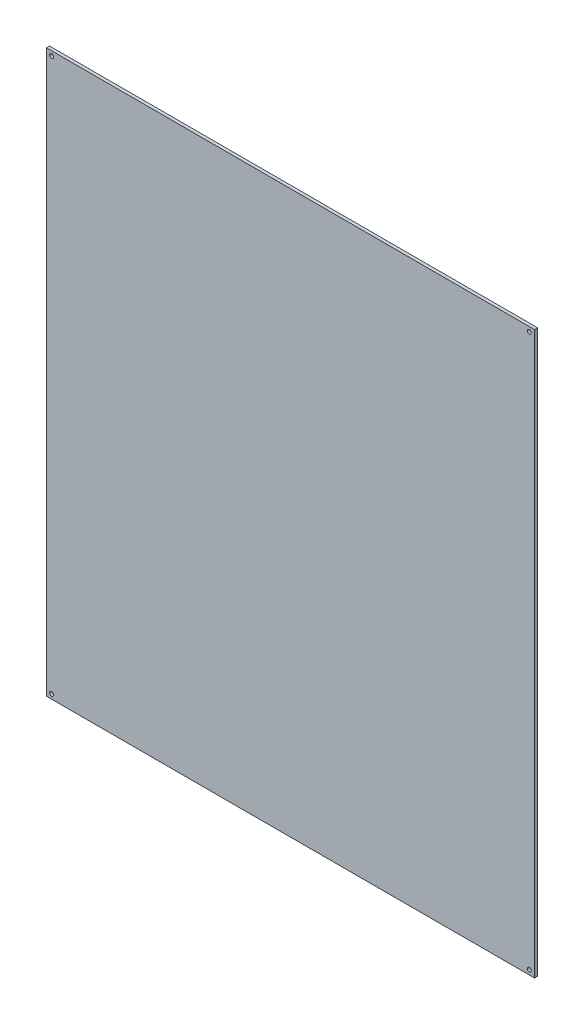
ISO-10303-21;
HEADER;
FILE_DESCRIPTION(('STEP AP214'),'2;1');
FILE_NAME('part.step','',(''),(''),'','','');
FILE_SCHEMA(('AUTOMOTIVE_DESIGN { 1 0 10303 214 1 1 1 1 }'));
ENDSEC;
DATA;
#1=APPLICATION_CONTEXT('core data for automotive mechanical design processes');
#2=APPLICATION_PROTOCOL_DEFINITION('international standard','automotive_design',2000,#1);
#3=PRODUCT_CONTEXT('',#1,'mechanical');
#4=PRODUCT('Part','Part','',(#3));
#5=PRODUCT_RELATED_PRODUCT_CATEGORY('part','',(#4));
#6=PRODUCT_DEFINITION_FORMATION('','',#4);
#7=PRODUCT_DEFINITION_CONTEXT('part definition',#1,'design');
#8=PRODUCT_DEFINITION('design','',#6,#7);
#9=PRODUCT_DEFINITION_SHAPE('','',#8);
#10=(LENGTH_UNIT() NAMED_UNIT(*) SI_UNIT(.MILLI.,.METRE.));
#11=(NAMED_UNIT(*) PLANE_ANGLE_UNIT() SI_UNIT($,.RADIAN.));
#12=(NAMED_UNIT(*) SI_UNIT($,.STERADIAN.) SOLID_ANGLE_UNIT());
#13=UNCERTAINTY_MEASURE_WITH_UNIT(LENGTH_MEASURE(1.E-05),#10,'distance_accuracy_value','');
#14=(GEOMETRIC_REPRESENTATION_CONTEXT(3) GLOBAL_UNCERTAINTY_ASSIGNED_CONTEXT((#13)) GLOBAL_UNIT_ASSIGNED_CONTEXT((#10,
#11,#12)) REPRESENTATION_CONTEXT('',''));
#15=CARTESIAN_POINT('',(0.,0.,0.));
#16=DIRECTION('',(0.,0.,1.));
#17=DIRECTION('',(1.,0.,0.));
#18=AXIS2_PLACEMENT_3D('',#15,#16,#17);
#19=CARTESIAN_POINT('',(-118.5,-197.5,0.));
#20=DIRECTION('',(0.,-1.,0.));
#21=DIRECTION('',(0.,0.,-1.));
#22=AXIS2_PLACEMENT_3D('',#19,#20,#21);
#23=PLANE('',#22);
#24=DIRECTION('',(1.,0.,0.));
#25=VECTOR('',#24,1.);
#26=CARTESIAN_POINT('',(-118.5,-197.5,5.));
#27=LINE('',#26,#25);
#28=CARTESIAN_POINT('',(-118.5,-197.5,5.));
#29=VERTEX_POINT('',#28);
#30=CARTESIAN_POINT('',(677.5,-197.5,5.));
#31=VERTEX_POINT('',#30);
#32=EDGE_CURVE('E98',#29,#31,#27,.T.);
#33=ORIENTED_EDGE('',*,*,#32,.F.);
#34=DIRECTION('',(0.,0.,1.));
#35=VECTOR('',#34,1.);
#36=CARTESIAN_POINT('',(-118.5,-197.5,0.));
#37=LINE('',#36,#35);
#38=CARTESIAN_POINT('',(-118.5,-197.5,0.));
#39=VERTEX_POINT('',#38);
#40=EDGE_CURVE('E11',#39,#29,#37,.T.);
#41=ORIENTED_EDGE('',*,*,#40,.F.);
#42=DIRECTION('',(1.,0.,0.));
#43=VECTOR('',#42,1.);
#44=CARTESIAN_POINT('',(-118.5,-197.5,0.));
#45=LINE('',#44,#43);
#46=CARTESIAN_POINT('',(677.5,-197.5,0.));
#47=VERTEX_POINT('',#46);
#48=EDGE_CURVE('E91',#39,#47,#45,.T.);
#49=ORIENTED_EDGE('',*,*,#48,.T.);
#50=DIRECTION('',(0.,0.,1.));
#51=VECTOR('',#50,1.);
#52=CARTESIAN_POINT('',(677.5,-197.5,0.));
#53=LINE('',#52,#51);
#54=EDGE_CURVE('E36',#47,#31,#53,.T.);
#55=ORIENTED_EDGE('',*,*,#54,.T.);
#56=EDGE_LOOP('',(#33,#41,#49,#55));
#57=FACE_BOUND('',#56,.T.);
#58=ADVANCED_FACE('F33',(#57),#23,.T.);
#59=CARTESIAN_POINT('',(-118.5,718.5,0.));
#60=DIRECTION('',(-1.,0.,0.));
#61=DIRECTION('',(0.,-1.,0.));
#62=AXIS2_PLACEMENT_3D('',#59,#60,#61);
#63=PLANE('',#62);
#64=DIRECTION('',(0.,-1.,0.));
#65=VECTOR('',#64,1.);
#66=CARTESIAN_POINT('',(-118.5,718.5,5.));
#67=LINE('',#66,#65);
#68=CARTESIAN_POINT('',(-118.5,718.5,5.));
#69=VERTEX_POINT('',#68);
#70=EDGE_CURVE('E93',#69,#29,#67,.T.);
#71=ORIENTED_EDGE('',*,*,#70,.F.);
#72=DIRECTION('',(0.,0.,1.));
#73=VECTOR('',#72,1.);
#74=CARTESIAN_POINT('',(-118.5,718.5,0.));
#75=LINE('',#74,#73);
#76=CARTESIAN_POINT('',(-118.5,718.5,0.));
#77=VERTEX_POINT('',#76);
#78=EDGE_CURVE('E42',#77,#69,#75,.T.);
#79=ORIENTED_EDGE('',*,*,#78,.F.);
#80=DIRECTION('',(0.,-1.,0.));
#81=VECTOR('',#80,1.);
#82=CARTESIAN_POINT('',(-118.5,718.5,0.));
#83=LINE('',#82,#81);
#84=EDGE_CURVE('E88',#77,#39,#83,.T.);
#85=ORIENTED_EDGE('',*,*,#84,.T.);
#86=ORIENTED_EDGE('',*,*,#40,.T.);
#87=EDGE_LOOP('',(#71,#79,#85,#86));
#88=FACE_BOUND('',#87,.T.);
#89=ADVANCED_FACE('F109',(#88),#63,.T.);
#90=CARTESIAN_POINT('',(677.5,718.5,0.));
#91=DIRECTION('',(0.,1.,0.));
#92=DIRECTION('',(-1.,0.,0.));
#93=AXIS2_PLACEMENT_3D('',#90,#91,#92);
#94=PLANE('',#93);
#95=DIRECTION('',(-1.,0.,0.));
#96=VECTOR('',#95,1.);
#97=CARTESIAN_POINT('',(677.5,718.5,5.));
#98=LINE('',#97,#96);
#99=CARTESIAN_POINT('',(677.5,718.5,5.));
#100=VERTEX_POINT('',#99);
#101=EDGE_CURVE('E83',#100,#69,#98,.T.);
#102=ORIENTED_EDGE('',*,*,#101,.F.);
#103=DIRECTION('',(0.,0.,1.));
#104=VECTOR('',#103,1.);
#105=CARTESIAN_POINT('',(677.5,718.5,0.));
#106=LINE('',#105,#104);
#107=CARTESIAN_POINT('',(677.5,718.5,0.));
#108=VERTEX_POINT('',#107);
#109=EDGE_CURVE('E78',#108,#100,#106,.T.);
#110=ORIENTED_EDGE('',*,*,#109,.F.);
#111=DIRECTION('',(-1.,0.,0.));
#112=VECTOR('',#111,1.);
#113=CARTESIAN_POINT('',(677.5,718.5,0.));
#114=LINE('',#113,#112);
#115=EDGE_CURVE('E81',#108,#77,#114,.T.);
#116=ORIENTED_EDGE('',*,*,#115,.T.);
#117=ORIENTED_EDGE('',*,*,#78,.T.);
#118=EDGE_LOOP('',(#102,#110,#116,#117));
#119=FACE_BOUND('',#118,.T.);
#120=ADVANCED_FACE('F80',(#119),#94,.T.);
#121=CARTESIAN_POINT('',(677.5,-197.5,0.));
#122=DIRECTION('',(1.,0.,0.));
#123=DIRECTION('',(0.,0.,-1.));
#124=AXIS2_PLACEMENT_3D('',#121,#122,#123);
#125=PLANE('',#124);
#126=DIRECTION('',(0.,1.,0.));
#127=VECTOR('',#126,1.);
#128=CARTESIAN_POINT('',(677.5,-197.5,5.));
#129=LINE('',#128,#127);
#130=EDGE_CURVE('E101',#31,#100,#129,.T.);
#131=ORIENTED_EDGE('',*,*,#130,.F.);
#132=ORIENTED_EDGE('',*,*,#54,.F.);
#133=DIRECTION('',(0.,1.,0.));
#134=VECTOR('',#133,1.);
#135=CARTESIAN_POINT('',(677.5,-197.5,0.));
#136=LINE('',#135,#134);
#137=EDGE_CURVE('E87',#47,#108,#136,.T.);
#138=ORIENTED_EDGE('',*,*,#137,.T.);
#139=ORIENTED_EDGE('',*,*,#109,.T.);
#140=EDGE_LOOP('',(#131,#132,#138,#139));
#141=FACE_BOUND('',#140,.T.);
#142=ADVANCED_FACE('F90',(#141),#125,.T.);
#143=CARTESIAN_POINT('',(0.,0.,0.));
#144=DIRECTION('',(0.,0.,1.));
#145=DIRECTION('',(1.,0.,0.));
#146=AXIS2_PLACEMENT_3D('',#143,#144,#145);
#147=PLANE('',#146);
#148=CARTESIAN_POINT('',(669.,-190.,0.));
#149=DIRECTION('',(0.,0.,1.));
#150=DIRECTION('',(-1.,0.,0.));
#151=AXIS2_PLACEMENT_3D('',#148,#149,#150);
#152=CIRCLE('',#151,3.24999999999995);
#153=CARTESIAN_POINT('',(665.75,-190.,0.));
#154=VERTEX_POINT('',#153);
#155=EDGE_CURVE('E150',#154,#154,#152,.T.);
#156=ORIENTED_EDGE('',*,*,#155,.T.);
#157=EDGE_LOOP('',(#156));
#158=FACE_BOUND('',#157,.T.);
#159=CARTESIAN_POINT('',(669.,711.,0.));
#160=DIRECTION('',(0.,0.,1.));
#161=DIRECTION('',(-1.,0.,0.));
#162=AXIS2_PLACEMENT_3D('',#159,#160,#161);
#163=CIRCLE('',#162,3.24999999999994);
#164=CARTESIAN_POINT('',(665.75,711.,0.));
#165=VERTEX_POINT('',#164);
#166=EDGE_CURVE('E158',#165,#165,#163,.T.);
#167=ORIENTED_EDGE('',*,*,#166,.T.);
#168=EDGE_LOOP('',(#167));
#169=FACE_BOUND('',#168,.T.);
#170=CARTESIAN_POINT('',(-110.,711.,0.));
#171=DIRECTION('',(0.,0.,1.));
#172=DIRECTION('',(-1.,0.,0.));
#173=AXIS2_PLACEMENT_3D('',#170,#171,#172);
#174=CIRCLE('',#173,3.24999999999997);
#175=CARTESIAN_POINT('',(-113.25,711.,0.));
#176=VERTEX_POINT('',#175);
#177=EDGE_CURVE('E164',#176,#176,#174,.T.);
#178=ORIENTED_EDGE('',*,*,#177,.T.);
#179=EDGE_LOOP('',(#178));
#180=FACE_BOUND('',#179,.T.);
#181=CARTESIAN_POINT('',(-110.,-190.,0.));
#182=DIRECTION('',(0.,0.,1.));
#183=DIRECTION('',(-1.,0.,0.));
#184=AXIS2_PLACEMENT_3D('',#181,#182,#183);
#185=CIRCLE('',#184,3.25);
#186=CARTESIAN_POINT('',(-113.25,-190.,0.));
#187=VERTEX_POINT('',#186);
#188=EDGE_CURVE('E102',#187,#187,#185,.T.);
#189=ORIENTED_EDGE('',*,*,#188,.T.);
#190=EDGE_LOOP('',(#189));
#191=FACE_BOUND('',#190,.T.);
#192=ORIENTED_EDGE('',*,*,#48,.F.);
#193=ORIENTED_EDGE('',*,*,#84,.F.);
#194=ORIENTED_EDGE('',*,*,#115,.F.);
#195=ORIENTED_EDGE('',*,*,#137,.F.);
#196=EDGE_LOOP('',(#192,#193,#194,#195));
#197=FACE_BOUND('',#196,.T.);
#198=ADVANCED_FACE('F86',(#158,#169,#180,#191,#197),#147,.F.);
#199=CARTESIAN_POINT('',(0.,0.,5.));
#200=DIRECTION('',(0.,0.,1.));
#201=DIRECTION('',(1.,0.,0.));
#202=AXIS2_PLACEMENT_3D('',#199,#200,#201);
#203=PLANE('',#202);
#204=CARTESIAN_POINT('',(669.,-190.,5.));
#205=DIRECTION('',(0.,0.,1.));
#206=DIRECTION('',(-1.,0.,0.));
#207=AXIS2_PLACEMENT_3D('',#204,#205,#206);
#208=CIRCLE('',#207,3.24999999999995);
#209=CARTESIAN_POINT('',(665.75,-190.,5.));
#210=VERTEX_POINT('',#209);
#211=EDGE_CURVE('E153',#210,#210,#208,.T.);
#212=ORIENTED_EDGE('',*,*,#211,.F.);
#213=EDGE_LOOP('',(#212));
#214=FACE_BOUND('',#213,.T.);
#215=CARTESIAN_POINT('',(669.,711.,5.));
#216=DIRECTION('',(0.,0.,1.));
#217=DIRECTION('',(-1.,0.,0.));
#218=AXIS2_PLACEMENT_3D('',#215,#216,#217);
#219=CIRCLE('',#218,3.24999999999994);
#220=CARTESIAN_POINT('',(665.75,711.,5.));
#221=VERTEX_POINT('',#220);
#222=EDGE_CURVE('E155',#221,#221,#219,.T.);
#223=ORIENTED_EDGE('',*,*,#222,.F.);
#224=EDGE_LOOP('',(#223));
#225=FACE_BOUND('',#224,.T.);
#226=CARTESIAN_POINT('',(-110.,711.,5.));
#227=DIRECTION('',(0.,0.,1.));
#228=DIRECTION('',(-1.,0.,0.));
#229=AXIS2_PLACEMENT_3D('',#226,#227,#228);
#230=CIRCLE('',#229,3.24999999999997);
#231=CARTESIAN_POINT('',(-113.25,711.,5.));
#232=VERTEX_POINT('',#231);
#233=EDGE_CURVE('E161',#232,#232,#230,.T.);
#234=ORIENTED_EDGE('',*,*,#233,.F.);
#235=EDGE_LOOP('',(#234));
#236=FACE_BOUND('',#235,.T.);
#237=CARTESIAN_POINT('',(-110.,-190.,5.));
#238=DIRECTION('',(0.,0.,1.));
#239=DIRECTION('',(-1.,0.,0.));
#240=AXIS2_PLACEMENT_3D('',#237,#238,#239);
#241=CIRCLE('',#240,3.25);
#242=CARTESIAN_POINT('',(-113.25,-190.,5.));
#243=VERTEX_POINT('',#242);
#244=EDGE_CURVE('E167',#243,#243,#241,.T.);
#245=ORIENTED_EDGE('',*,*,#244,.F.);
#246=EDGE_LOOP('',(#245));
#247=FACE_BOUND('',#246,.T.);
#248=ORIENTED_EDGE('',*,*,#32,.T.);
#249=ORIENTED_EDGE('',*,*,#130,.T.);
#250=ORIENTED_EDGE('',*,*,#101,.T.);
#251=ORIENTED_EDGE('',*,*,#70,.T.);
#252=EDGE_LOOP('',(#248,#249,#250,#251));
#253=FACE_BOUND('',#252,.T.);
#254=ADVANCED_FACE('F108',(#214,#225,#236,#247,#253),#203,.T.);
#255=CARTESIAN_POINT('',(-110.,-190.,0.));
#256=DIRECTION('',(0.,0.,1.));
#257=DIRECTION('',(1.,0.,0.));
#258=AXIS2_PLACEMENT_3D('',#255,#256,#257);
#259=CYLINDRICAL_SURFACE('',#258,3.25);
#260=ORIENTED_EDGE('',*,*,#188,.F.);
#261=EDGE_LOOP('',(#260));
#262=FACE_BOUND('',#261,.T.);
#263=ORIENTED_EDGE('',*,*,#244,.T.);
#264=EDGE_LOOP('',(#263));
#265=FACE_BOUND('',#264,.T.);
#266=ADVANCED_FACE('F127',(#262,#265),#259,.F.);
#267=CARTESIAN_POINT('',(-110.,711.,0.));
#268=DIRECTION('',(0.,0.,1.));
#269=DIRECTION('',(1.,0.,0.));
#270=AXIS2_PLACEMENT_3D('',#267,#268,#269);
#271=CYLINDRICAL_SURFACE('',#270,3.24999999999997);
#272=ORIENTED_EDGE('',*,*,#177,.F.);
#273=EDGE_LOOP('',(#272));
#274=FACE_BOUND('',#273,.T.);
#275=ORIENTED_EDGE('',*,*,#233,.T.);
#276=EDGE_LOOP('',(#275));
#277=FACE_BOUND('',#276,.T.);
#278=ADVANCED_FACE('F134',(#274,#277),#271,.F.);
#279=CARTESIAN_POINT('',(669.,711.,0.));
#280=DIRECTION('',(0.,0.,1.));
#281=DIRECTION('',(1.,0.,0.));
#282=AXIS2_PLACEMENT_3D('',#279,#280,#281);
#283=CYLINDRICAL_SURFACE('',#282,3.24999999999994);
#284=ORIENTED_EDGE('',*,*,#166,.F.);
#285=EDGE_LOOP('',(#284));
#286=FACE_BOUND('',#285,.T.);
#287=ORIENTED_EDGE('',*,*,#222,.T.);
#288=EDGE_LOOP('',(#287));
#289=FACE_BOUND('',#288,.T.);
#290=ADVANCED_FACE('F138',(#286,#289),#283,.F.);
#291=CARTESIAN_POINT('',(669.,-190.,0.));
#292=DIRECTION('',(0.,0.,1.));
#293=DIRECTION('',(1.,0.,0.));
#294=AXIS2_PLACEMENT_3D('',#291,#292,#293);
#295=CYLINDRICAL_SURFACE('',#294,3.24999999999995);
#296=ORIENTED_EDGE('',*,*,#155,.F.);
#297=EDGE_LOOP('',(#296));
#298=FACE_BOUND('',#297,.T.);
#299=ORIENTED_EDGE('',*,*,#211,.T.);
#300=EDGE_LOOP('',(#299));
#301=FACE_BOUND('',#300,.T.);
#302=ADVANCED_FACE('F142',(#298,#301),#295,.F.);
#303=CLOSED_SHELL('',(#58,#89,#120,#142,#198,#254,#266,#278,#290,#302));
#304=MANIFOLD_SOLID_BREP('B2',#303);
#305=ADVANCED_BREP_SHAPE_REPRESENTATION('',(#18,#304),#14);
#306=SHAPE_DEFINITION_REPRESENTATION(#9,#305);
ENDSEC;
END-ISO-10303-21;
